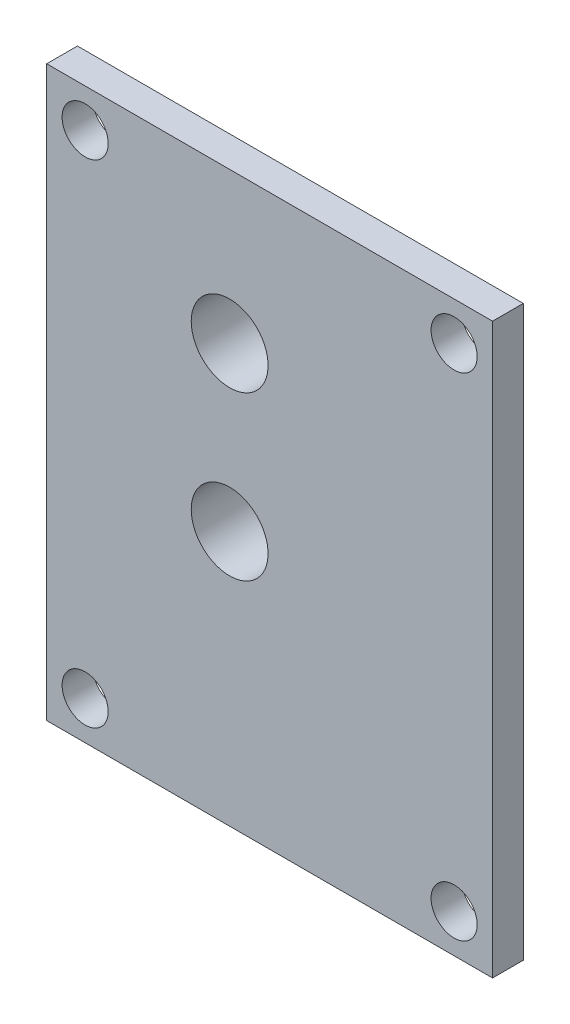
ISO-10303-21;
HEADER;
FILE_DESCRIPTION(('STEP AP214'),'2;1');
FILE_NAME('part.step','',(''),(''),'','','');
FILE_SCHEMA(('AUTOMOTIVE_DESIGN { 1 0 10303 214 1 1 1 1 }'));
ENDSEC;
DATA;
#1=APPLICATION_CONTEXT('core data for automotive mechanical design processes');
#2=APPLICATION_PROTOCOL_DEFINITION('international standard','automotive_design',2000,#1);
#3=PRODUCT_CONTEXT('',#1,'mechanical');
#4=PRODUCT('Part','Part','',(#3));
#5=PRODUCT_RELATED_PRODUCT_CATEGORY('part','',(#4));
#6=PRODUCT_DEFINITION_FORMATION('','',#4);
#7=PRODUCT_DEFINITION_CONTEXT('part definition',#1,'design');
#8=PRODUCT_DEFINITION('design','',#6,#7);
#9=PRODUCT_DEFINITION_SHAPE('','',#8);
#10=(LENGTH_UNIT() NAMED_UNIT(*) SI_UNIT(.MILLI.,.METRE.));
#11=(NAMED_UNIT(*) PLANE_ANGLE_UNIT() SI_UNIT($,.RADIAN.));
#12=(NAMED_UNIT(*) SI_UNIT($,.STERADIAN.) SOLID_ANGLE_UNIT());
#13=UNCERTAINTY_MEASURE_WITH_UNIT(LENGTH_MEASURE(1.E-05),#10,'distance_accuracy_value','');
#14=(GEOMETRIC_REPRESENTATION_CONTEXT(3) GLOBAL_UNCERTAINTY_ASSIGNED_CONTEXT((#13)) GLOBAL_UNIT_ASSIGNED_CONTEXT((#10,
#11,#12)) REPRESENTATION_CONTEXT('',''));
#15=CARTESIAN_POINT('',(0.,0.,0.));
#16=DIRECTION('',(0.,0.,1.));
#17=DIRECTION('',(1.,0.,0.));
#18=AXIS2_PLACEMENT_3D('',#15,#16,#17);
#19=CARTESIAN_POINT('',(0.,0.,3.66263657234832));
#20=DIRECTION('',(0.,0.,-1.));
#21=DIRECTION('',(-1.,0.,0.));
#22=AXIS2_PLACEMENT_3D('',#19,#20,#21);
#23=PLANE('',#22);
#24=CARTESIAN_POINT('',(63.6725369246258,1.84415348007562,3.66263657234832));
#25=DIRECTION('',(0.,0.,-1.));
#26=DIRECTION('',(-1.,0.,0.));
#27=AXIS2_PLACEMENT_3D('',#24,#25,#26);
#28=CIRCLE('',#27,3.5);
#29=CARTESIAN_POINT('',(60.1725369246258,1.84415348007562,3.66263657234832));
#30=VERTEX_POINT('',#29);
#31=EDGE_CURVE('E115',#30,#30,#28,.T.);
#32=ORIENTED_EDGE('',*,*,#31,.F.);
#33=EDGE_LOOP('',(#32));
#34=FACE_BOUND('',#33,.T.);
#35=CARTESIAN_POINT('',(63.6725369246238,12.4441534800763,3.66263657234832));
#36=DIRECTION('',(0.,0.,-1.));
#37=DIRECTION('',(-1.,0.,0.));
#38=AXIS2_PLACEMENT_3D('',#35,#36,#37);
#39=CIRCLE('',#38,3.5);
#40=CARTESIAN_POINT('',(60.1725369246238,12.4441534800763,3.66263657234832));
#41=VERTEX_POINT('',#40);
#42=EDGE_CURVE('E120',#41,#41,#39,.T.);
#43=ORIENTED_EDGE('',*,*,#42,.F.);
#44=EDGE_LOOP('',(#43));
#45=FACE_BOUND('',#44,.T.);
#46=DIRECTION('',(0.,1.,0.));
#47=VECTOR('',#46,1.);
#48=CARTESIAN_POINT('',(80.7725369246258,22.2441534800756,3.66263657234832));
#49=LINE('',#48,#47);
#50=CARTESIAN_POINT('',(80.7725369246258,-14.7558465199244,3.66263657234832));
#51=VERTEX_POINT('',#50);
#52=CARTESIAN_POINT('',(80.7725369246258,22.2441534800756,3.66263657234832));
#53=VERTEX_POINT('',#52);
#54=EDGE_CURVE('E74',#51,#53,#49,.T.);
#55=ORIENTED_EDGE('',*,*,#54,.F.);
#56=DIRECTION('',(1.,0.,0.));
#57=VECTOR('',#56,1.);
#58=CARTESIAN_POINT('',(80.7725369246258,-14.7558465199244,3.66263657234832));
#59=LINE('',#58,#57);
#60=CARTESIAN_POINT('',(51.7725369246258,-14.7558465199244,3.66263657234832));
#61=VERTEX_POINT('',#60);
#62=EDGE_CURVE('E78',#61,#51,#59,.T.);
#63=ORIENTED_EDGE('',*,*,#62,.F.);
#64=DIRECTION('',(0.,-1.,0.));
#65=VECTOR('',#64,1.);
#66=CARTESIAN_POINT('',(51.7725369246258,22.2441534800756,3.66263657234832));
#67=LINE('',#66,#65);
#68=CARTESIAN_POINT('',(51.7725369246258,22.2441534800756,3.66263657234832));
#69=VERTEX_POINT('',#68);
#70=EDGE_CURVE('E58',#69,#61,#67,.T.);
#71=ORIENTED_EDGE('',*,*,#70,.F.);
#72=DIRECTION('',(-1.,0.,0.));
#73=VECTOR('',#72,1.);
#74=CARTESIAN_POINT('',(80.7725369246258,22.2441534800756,3.66263657234832));
#75=LINE('',#74,#73);
#76=EDGE_CURVE('E52',#53,#69,#75,.T.);
#77=ORIENTED_EDGE('',*,*,#76,.F.);
#78=EDGE_LOOP('',(#55,#63,#71,#77));
#79=FACE_BOUND('',#78,.T.);
#80=CARTESIAN_POINT('',(78.2725369246258,19.7441534800756,3.66263657234832));
#81=DIRECTION('',(0.,0.,-1.));
#82=DIRECTION('',(-1.,0.,0.));
#83=AXIS2_PLACEMENT_3D('',#80,#81,#82);
#84=CIRCLE('',#83,1.5);
#85=CARTESIAN_POINT('',(76.7725369246258,19.7441534800756,3.66263657234832));
#86=VERTEX_POINT('',#85);
#87=EDGE_CURVE('E236',#86,#86,#84,.F.);
#88=ORIENTED_EDGE('',*,*,#87,.T.);
#89=EDGE_LOOP('',(#88));
#90=FACE_BOUND('',#89,.T.);
#91=CARTESIAN_POINT('',(54.2725369246258,-12.2558465199244,3.66263657234832));
#92=DIRECTION('',(0.,0.,-1.));
#93=DIRECTION('',(-1.,0.,0.));
#94=AXIS2_PLACEMENT_3D('',#91,#92,#93);
#95=CIRCLE('',#94,1.5);
#96=CARTESIAN_POINT('',(52.7725369246258,-12.2558465199244,3.66263657234832));
#97=VERTEX_POINT('',#96);
#98=EDGE_CURVE('E233',#97,#97,#95,.F.);
#99=ORIENTED_EDGE('',*,*,#98,.T.);
#100=EDGE_LOOP('',(#99));
#101=FACE_BOUND('',#100,.T.);
#102=CARTESIAN_POINT('',(78.2725369246258,-12.2558465199244,3.66263657234832));
#103=DIRECTION('',(0.,0.,-1.));
#104=DIRECTION('',(-1.,0.,0.));
#105=AXIS2_PLACEMENT_3D('',#102,#103,#104);
#106=CIRCLE('',#105,1.5);
#107=CARTESIAN_POINT('',(76.7725369246258,-12.2558465199244,3.66263657234832));
#108=VERTEX_POINT('',#107);
#109=EDGE_CURVE('E230',#108,#108,#106,.F.);
#110=ORIENTED_EDGE('',*,*,#109,.T.);
#111=EDGE_LOOP('',(#110));
#112=FACE_BOUND('',#111,.T.);
#113=CARTESIAN_POINT('',(54.2725369246258,19.7441534800756,3.66263657234832));
#114=DIRECTION('',(0.,0.,-1.));
#115=DIRECTION('',(-1.,0.,0.));
#116=AXIS2_PLACEMENT_3D('',#113,#114,#115);
#117=CIRCLE('',#116,1.5);
#118=CARTESIAN_POINT('',(52.7725369246258,19.7441534800756,3.66263657234832));
#119=VERTEX_POINT('',#118);
#120=EDGE_CURVE('E111',#119,#119,#117,.F.);
#121=ORIENTED_EDGE('',*,*,#120,.T.);
#122=EDGE_LOOP('',(#121));
#123=FACE_BOUND('',#122,.T.);
#124=ADVANCED_FACE('F37',(#34,#45,#79,#90,#101,#112,#123),#23,.T.);
#125=CARTESIAN_POINT('',(0.,0.,5.66263657234832));
#126=DIRECTION('',(0.,0.,-1.));
#127=DIRECTION('',(-1.,0.,0.));
#128=AXIS2_PLACEMENT_3D('',#125,#126,#127);
#129=PLANE('',#128);
#130=CARTESIAN_POINT('',(63.6725369246258,12.4441534800756,5.66263657234832));
#131=DIRECTION('',(0.,0.,-1.));
#132=DIRECTION('',(-1.,0.,0.));
#133=AXIS2_PLACEMENT_3D('',#130,#131,#132);
#134=CIRCLE('',#133,2.5);
#135=CARTESIAN_POINT('',(61.1725369246258,12.4441534800756,5.66263657234832));
#136=VERTEX_POINT('',#135);
#137=EDGE_CURVE('E107',#136,#136,#134,.T.);
#138=ORIENTED_EDGE('',*,*,#137,.T.);
#139=EDGE_LOOP('',(#138));
#140=FACE_BOUND('',#139,.T.);
#141=CARTESIAN_POINT('',(63.6725369246258,1.84415348007562,5.66263657234832));
#142=DIRECTION('',(0.,0.,-1.));
#143=DIRECTION('',(-1.,0.,0.));
#144=AXIS2_PLACEMENT_3D('',#141,#142,#143);
#145=CIRCLE('',#144,2.5);
#146=CARTESIAN_POINT('',(61.1725369246258,1.84415348007562,5.66263657234832));
#147=VERTEX_POINT('',#146);
#148=EDGE_CURVE('E108',#147,#147,#145,.T.);
#149=ORIENTED_EDGE('',*,*,#148,.T.);
#150=EDGE_LOOP('',(#149));
#151=FACE_BOUND('',#150,.T.);
#152=CARTESIAN_POINT('',(54.2725369246258,-12.2558465199244,5.66263657234832));
#153=DIRECTION('',(0.,0.,1.));
#154=DIRECTION('',(1.,0.,0.));
#155=AXIS2_PLACEMENT_3D('',#152,#153,#154);
#156=CIRCLE('',#155,1.5);
#157=CARTESIAN_POINT('',(55.7725369246258,-12.2558465199244,5.66263657234832));
#158=VERTEX_POINT('',#157);
#159=EDGE_CURVE('E214',#158,#158,#156,.T.);
#160=ORIENTED_EDGE('',*,*,#159,.F.);
#161=EDGE_LOOP('',(#160));
#162=FACE_BOUND('',#161,.T.);
#163=CARTESIAN_POINT('',(78.2725369246258,-12.2558465199244,5.66263657234832));
#164=DIRECTION('',(0.,0.,1.));
#165=DIRECTION('',(1.,0.,0.));
#166=AXIS2_PLACEMENT_3D('',#163,#164,#165);
#167=CIRCLE('',#166,1.5);
#168=CARTESIAN_POINT('',(79.7725369246258,-12.2558465199244,5.66263657234832));
#169=VERTEX_POINT('',#168);
#170=EDGE_CURVE('E217',#169,#169,#167,.T.);
#171=ORIENTED_EDGE('',*,*,#170,.F.);
#172=EDGE_LOOP('',(#171));
#173=FACE_BOUND('',#172,.T.);
#174=CARTESIAN_POINT('',(78.2725369246258,19.7441534800756,5.66263657234832));
#175=DIRECTION('',(0.,0.,1.));
#176=DIRECTION('',(1.,0.,0.));
#177=AXIS2_PLACEMENT_3D('',#174,#175,#176);
#178=CIRCLE('',#177,1.5);
#179=CARTESIAN_POINT('',(79.7725369246258,19.7441534800756,5.66263657234832));
#180=VERTEX_POINT('',#179);
#181=EDGE_CURVE('E223',#180,#180,#178,.T.);
#182=ORIENTED_EDGE('',*,*,#181,.F.);
#183=EDGE_LOOP('',(#182));
#184=FACE_BOUND('',#183,.T.);
#185=CARTESIAN_POINT('',(54.2725369246258,19.7441534800756,5.66263657234832));
#186=DIRECTION('',(0.,0.,1.));
#187=DIRECTION('',(1.,0.,0.));
#188=AXIS2_PLACEMENT_3D('',#185,#186,#187);
#189=CIRCLE('',#188,1.5);
#190=CARTESIAN_POINT('',(55.7725369246258,19.7441534800756,5.66263657234832));
#191=VERTEX_POINT('',#190);
#192=EDGE_CURVE('E102',#191,#191,#189,.T.);
#193=ORIENTED_EDGE('',*,*,#192,.F.);
#194=EDGE_LOOP('',(#193));
#195=FACE_BOUND('',#194,.T.);
#196=DIRECTION('',(0.,1.,0.));
#197=VECTOR('',#196,1.);
#198=CARTESIAN_POINT('',(80.7725369246258,22.2441534800756,5.66263657234832));
#199=LINE('',#198,#197);
#200=CARTESIAN_POINT('',(80.7725369246258,-14.7558465199244,5.66263657234832));
#201=VERTEX_POINT('',#200);
#202=CARTESIAN_POINT('',(80.7725369246258,22.2441534800756,5.66263657234832));
#203=VERTEX_POINT('',#202);
#204=EDGE_CURVE('E88',#201,#203,#199,.T.);
#205=ORIENTED_EDGE('',*,*,#204,.T.);
#206=DIRECTION('',(-1.,0.,0.));
#207=VECTOR('',#206,1.);
#208=CARTESIAN_POINT('',(80.7725369246258,22.2441534800756,5.66263657234832));
#209=LINE('',#208,#207);
#210=CARTESIAN_POINT('',(51.7725369246258,22.2441534800756,5.66263657234832));
#211=VERTEX_POINT('',#210);
#212=EDGE_CURVE('E207',#203,#211,#209,.T.);
#213=ORIENTED_EDGE('',*,*,#212,.T.);
#214=DIRECTION('',(0.,-1.,0.));
#215=VECTOR('',#214,1.);
#216=CARTESIAN_POINT('',(51.7725369246258,22.2441534800756,5.66263657234832));
#217=LINE('',#216,#215);
#218=CARTESIAN_POINT('',(51.7725369246258,-14.7558465199244,5.66263657234832));
#219=VERTEX_POINT('',#218);
#220=EDGE_CURVE('E211',#211,#219,#217,.T.);
#221=ORIENTED_EDGE('',*,*,#220,.T.);
#222=DIRECTION('',(1.,0.,0.));
#223=VECTOR('',#222,1.);
#224=CARTESIAN_POINT('',(80.7725369246258,-14.7558465199244,5.66263657234832));
#225=LINE('',#224,#223);
#226=EDGE_CURVE('E213',#219,#201,#225,.T.);
#227=ORIENTED_EDGE('',*,*,#226,.T.);
#228=EDGE_LOOP('',(#205,#213,#221,#227));
#229=FACE_BOUND('',#228,.T.);
#230=ADVANCED_FACE('F146',(#140,#151,#162,#173,#184,#195,#229),#129,.F.);
#231=CARTESIAN_POINT('',(63.6725369246258,12.4441534800756,0.662636572348317));
#232=DIRECTION('',(0.,0.,-1.));
#233=DIRECTION('',(-1.,0.,0.));
#234=AXIS2_PLACEMENT_3D('',#231,#232,#233);
#235=PLANE('',#234);
#236=CARTESIAN_POINT('',(63.6725369246258,12.4441534800756,0.662636572348317));
#237=DIRECTION('',(0.,0.,-1.));
#238=DIRECTION('',(-1.,0.,0.));
#239=AXIS2_PLACEMENT_3D('',#236,#237,#238);
#240=CIRCLE('',#239,3.00000000000208);
#241=CARTESIAN_POINT('',(60.6725369246237,12.4441534800756,0.662636572348317));
#242=VERTEX_POINT('',#241);
#243=EDGE_CURVE('E45',#242,#242,#240,.T.);
#244=ORIENTED_EDGE('',*,*,#243,.T.);
#245=EDGE_LOOP('',(#244));
#246=FACE_BOUND('',#245,.T.);
#247=CARTESIAN_POINT('',(63.6725369246258,12.4441534800756,0.662636572348317));
#248=DIRECTION('',(0.,0.,-1.));
#249=DIRECTION('',(-1.,0.,0.));
#250=AXIS2_PLACEMENT_3D('',#247,#248,#249);
#251=CIRCLE('',#250,2.5);
#252=CARTESIAN_POINT('',(61.1725369246258,12.4441534800756,0.662636572348317));
#253=VERTEX_POINT('',#252);
#254=EDGE_CURVE('E112',#253,#253,#251,.T.);
#255=ORIENTED_EDGE('',*,*,#254,.F.);
#256=EDGE_LOOP('',(#255));
#257=FACE_BOUND('',#256,.T.);
#258=ADVANCED_FACE('F131',(#246,#257),#235,.T.);
#259=CARTESIAN_POINT('',(63.6725369246258,12.4441534800756,0.662636572348317));
#260=DIRECTION('',(0.,0.,1.));
#261=DIRECTION('',(1.,0.,0.));
#262=AXIS2_PLACEMENT_3D('',#259,#260,#261);
#263=CYLINDRICAL_SURFACE('',#262,3.50000000000208);
#264=CARTESIAN_POINT('',(63.6725369246258,12.4441534800756,1.16263657234832));
#265=DIRECTION('',(0.,0.,-1.));
#266=DIRECTION('',(-1.,0.,0.));
#267=AXIS2_PLACEMENT_3D('',#264,#265,#266);
#268=CIRCLE('',#267,3.50000000000208);
#269=CARTESIAN_POINT('',(60.1725369246237,12.4441534800756,1.16263657234832));
#270=VERTEX_POINT('',#269);
#271=EDGE_CURVE('E11',#270,#270,#268,.F.);
#272=ORIENTED_EDGE('',*,*,#271,.T.);
#273=EDGE_LOOP('',(#272));
#274=FACE_BOUND('',#273,.T.);
#275=ORIENTED_EDGE('',*,*,#42,.T.);
#276=EDGE_LOOP('',(#275));
#277=FACE_BOUND('',#276,.T.);
#278=ADVANCED_FACE('F157',(#274,#277),#263,.T.);
#279=CARTESIAN_POINT('',(63.6725369246258,12.4441534800756,0.662636572348317));
#280=DIRECTION('',(0.,0.,1.));
#281=DIRECTION('',(1.,0.,0.));
#282=AXIS2_PLACEMENT_3D('',#279,#280,#281);
#283=CYLINDRICAL_SURFACE('',#282,2.5);
#284=ORIENTED_EDGE('',*,*,#254,.T.);
#285=EDGE_LOOP('',(#284));
#286=FACE_BOUND('',#285,.T.);
#287=ORIENTED_EDGE('',*,*,#137,.F.);
#288=EDGE_LOOP('',(#287));
#289=FACE_BOUND('',#288,.T.);
#290=ADVANCED_FACE('F160',(#286,#289),#283,.F.);
#291=CARTESIAN_POINT('',(63.6725369246258,1.84415348007562,0.662636572348317));
#292=DIRECTION('',(0.,0.,-1.));
#293=DIRECTION('',(-1.,0.,0.));
#294=AXIS2_PLACEMENT_3D('',#291,#292,#293);
#295=PLANE('',#294);
#296=CARTESIAN_POINT('',(63.6725369246258,1.84415348007562,0.662636572348317));
#297=DIRECTION('',(0.,0.,-1.));
#298=DIRECTION('',(-1.,0.,0.));
#299=AXIS2_PLACEMENT_3D('',#296,#297,#298);
#300=CIRCLE('',#299,3.00000000000001);
#301=CARTESIAN_POINT('',(60.6725369246258,1.84415348007562,0.662636572348317));
#302=VERTEX_POINT('',#301);
#303=EDGE_CURVE('E123',#302,#302,#300,.T.);
#304=ORIENTED_EDGE('',*,*,#303,.T.);
#305=EDGE_LOOP('',(#304));
#306=FACE_BOUND('',#305,.T.);
#307=CARTESIAN_POINT('',(63.6725369246258,1.84415348007562,0.662636572348317));
#308=DIRECTION('',(0.,0.,-1.));
#309=DIRECTION('',(-1.,0.,0.));
#310=AXIS2_PLACEMENT_3D('',#307,#308,#309);
#311=CIRCLE('',#310,2.5);
#312=CARTESIAN_POINT('',(61.1725369246258,1.84415348007562,0.662636572348317));
#313=VERTEX_POINT('',#312);
#314=EDGE_CURVE('E104',#313,#313,#311,.T.);
#315=ORIENTED_EDGE('',*,*,#314,.F.);
#316=EDGE_LOOP('',(#315));
#317=FACE_BOUND('',#316,.T.);
#318=ADVANCED_FACE('F166',(#306,#317),#295,.T.);
#319=CARTESIAN_POINT('',(63.6725369246258,1.84415348007562,0.662636572348317));
#320=DIRECTION('',(0.,0.,1.));
#321=DIRECTION('',(1.,0.,0.));
#322=AXIS2_PLACEMENT_3D('',#319,#320,#321);
#323=CYLINDRICAL_SURFACE('',#322,3.50000000000001);
#324=CARTESIAN_POINT('',(63.6725369246258,1.84415348007562,1.16263657234832));
#325=DIRECTION('',(0.,0.,-1.));
#326=DIRECTION('',(-1.,0.,0.));
#327=AXIS2_PLACEMENT_3D('',#324,#325,#326);
#328=CIRCLE('',#327,3.50000000000001);
#329=CARTESIAN_POINT('',(60.1725369246258,1.84415348007562,1.16263657234832));
#330=VERTEX_POINT('',#329);
#331=EDGE_CURVE('E126',#330,#330,#328,.F.);
#332=ORIENTED_EDGE('',*,*,#331,.T.);
#333=EDGE_LOOP('',(#332));
#334=FACE_BOUND('',#333,.T.);
#335=ORIENTED_EDGE('',*,*,#31,.T.);
#336=EDGE_LOOP('',(#335));
#337=FACE_BOUND('',#336,.T.);
#338=ADVANCED_FACE('F168',(#334,#337),#323,.T.);
#339=CARTESIAN_POINT('',(63.6725369246258,1.84415348007562,0.662636572348317));
#340=DIRECTION('',(0.,0.,1.));
#341=DIRECTION('',(1.,0.,0.));
#342=AXIS2_PLACEMENT_3D('',#339,#340,#341);
#343=CYLINDRICAL_SURFACE('',#342,2.5);
#344=ORIENTED_EDGE('',*,*,#314,.T.);
#345=EDGE_LOOP('',(#344));
#346=FACE_BOUND('',#345,.T.);
#347=ORIENTED_EDGE('',*,*,#148,.F.);
#348=EDGE_LOOP('',(#347));
#349=FACE_BOUND('',#348,.T.);
#350=ADVANCED_FACE('F142',(#346,#349),#343,.F.);
#351=CARTESIAN_POINT('',(63.6725369246258,1.84415348007562,1.16263657234832));
#352=DIRECTION('',(0.,0.,-1.));
#353=DIRECTION('',(-1.,0.,0.));
#354=AXIS2_PLACEMENT_3D('',#351,#352,#353);
#355=TOROIDAL_SURFACE('',#354,3.00000000000001,0.5);
#356=ORIENTED_EDGE('',*,*,#331,.F.);
#357=EDGE_LOOP('',(#356));
#358=FACE_BOUND('',#357,.T.);
#359=ORIENTED_EDGE('',*,*,#303,.F.);
#360=EDGE_LOOP('',(#359));
#361=FACE_BOUND('',#360,.T.);
#362=ADVANCED_FACE('F135',(#358,#361),#355,.T.);
#363=CARTESIAN_POINT('',(63.6725369246258,12.4441534800756,1.16263657234832));
#364=DIRECTION('',(0.,0.,-1.));
#365=DIRECTION('',(-1.,0.,0.));
#366=AXIS2_PLACEMENT_3D('',#363,#364,#365);
#367=TOROIDAL_SURFACE('',#366,3.00000000000208,0.5);
#368=ORIENTED_EDGE('',*,*,#271,.F.);
#369=EDGE_LOOP('',(#368));
#370=FACE_BOUND('',#369,.T.);
#371=ORIENTED_EDGE('',*,*,#243,.F.);
#372=EDGE_LOOP('',(#371));
#373=FACE_BOUND('',#372,.T.);
#374=ADVANCED_FACE('F39',(#370,#373),#367,.T.);
#375=CARTESIAN_POINT('',(80.7725369246258,22.2441534800756,-43.3480005218243));
#376=DIRECTION('',(1.,0.,0.));
#377=DIRECTION('',(0.,0.,-1.));
#378=AXIS2_PLACEMENT_3D('',#375,#376,#377);
#379=PLANE('',#378);
#380=DIRECTION('',(0.,0.,1.));
#381=VECTOR('',#380,1.);
#382=CARTESIAN_POINT('',(80.7725369246258,-14.7558465199244,-43.3480005218243));
#383=LINE('',#382,#381);
#384=EDGE_CURVE('E85',#51,#201,#383,.T.);
#385=ORIENTED_EDGE('',*,*,#384,.F.);
#386=ORIENTED_EDGE('',*,*,#54,.T.);
#387=DIRECTION('',(0.,0.,1.));
#388=VECTOR('',#387,1.);
#389=CARTESIAN_POINT('',(80.7725369246258,22.2441534800756,-43.3480005218243));
#390=LINE('',#389,#388);
#391=EDGE_CURVE('E82',#53,#203,#390,.T.);
#392=ORIENTED_EDGE('',*,*,#391,.T.);
#393=ORIENTED_EDGE('',*,*,#204,.F.);
#394=EDGE_LOOP('',(#385,#386,#392,#393));
#395=FACE_BOUND('',#394,.T.);
#396=ADVANCED_FACE('F86',(#395),#379,.T.);
#397=CARTESIAN_POINT('',(80.7725369246258,-14.7558465199244,-43.3480005218243));
#398=DIRECTION('',(0.,-1.,0.));
#399=DIRECTION('',(1.,0.,0.));
#400=AXIS2_PLACEMENT_3D('',#397,#398,#399);
#401=PLANE('',#400);
#402=DIRECTION('',(0.,0.,1.));
#403=VECTOR('',#402,1.);
#404=CARTESIAN_POINT('',(51.7725369246258,-14.7558465199244,-43.3480005218243));
#405=LINE('',#404,#403);
#406=EDGE_CURVE('E94',#61,#219,#405,.T.);
#407=ORIENTED_EDGE('',*,*,#406,.F.);
#408=ORIENTED_EDGE('',*,*,#62,.T.);
#409=ORIENTED_EDGE('',*,*,#384,.T.);
#410=ORIENTED_EDGE('',*,*,#226,.F.);
#411=EDGE_LOOP('',(#407,#408,#409,#410));
#412=FACE_BOUND('',#411,.T.);
#413=ADVANCED_FACE('F93',(#412),#401,.T.);
#414=CARTESIAN_POINT('',(51.7725369246258,22.2441534800756,-43.3480005218243));
#415=DIRECTION('',(-1.,0.,0.));
#416=DIRECTION('',(0.,-1.,0.));
#417=AXIS2_PLACEMENT_3D('',#414,#415,#416);
#418=PLANE('',#417);
#419=DIRECTION('',(0.,0.,1.));
#420=VECTOR('',#419,1.);
#421=CARTESIAN_POINT('',(51.7725369246258,22.2441534800756,-43.3480005218243));
#422=LINE('',#421,#420);
#423=EDGE_CURVE('E101',#69,#211,#422,.T.);
#424=ORIENTED_EDGE('',*,*,#423,.F.);
#425=ORIENTED_EDGE('',*,*,#70,.T.);
#426=ORIENTED_EDGE('',*,*,#406,.T.);
#427=ORIENTED_EDGE('',*,*,#220,.F.);
#428=EDGE_LOOP('',(#424,#425,#426,#427));
#429=FACE_BOUND('',#428,.T.);
#430=ADVANCED_FACE('F197',(#429),#418,.T.);
#431=CARTESIAN_POINT('',(80.7725369246258,22.2441534800756,-43.3480005218243));
#432=DIRECTION('',(0.,1.,0.));
#433=DIRECTION('',(-1.,0.,0.));
#434=AXIS2_PLACEMENT_3D('',#431,#432,#433);
#435=PLANE('',#434);
#436=ORIENTED_EDGE('',*,*,#391,.F.);
#437=ORIENTED_EDGE('',*,*,#76,.T.);
#438=ORIENTED_EDGE('',*,*,#423,.T.);
#439=ORIENTED_EDGE('',*,*,#212,.F.);
#440=EDGE_LOOP('',(#436,#437,#438,#439));
#441=FACE_BOUND('',#440,.T.);
#442=ADVANCED_FACE('F192',(#441),#435,.T.);
#443=CARTESIAN_POINT('',(54.2725369246258,19.7441534800756,-43.3480005218243));
#444=DIRECTION('',(0.,0.,1.));
#445=DIRECTION('',(1.,0.,0.));
#446=AXIS2_PLACEMENT_3D('',#443,#444,#445);
#447=CYLINDRICAL_SURFACE('',#446,1.5);
#448=ORIENTED_EDGE('',*,*,#192,.T.);
#449=EDGE_LOOP('',(#448));
#450=FACE_BOUND('',#449,.T.);
#451=ORIENTED_EDGE('',*,*,#120,.F.);
#452=EDGE_LOOP('',(#451));
#453=FACE_BOUND('',#452,.T.);
#454=ADVANCED_FACE('F189',(#450,#453),#447,.F.);
#455=CARTESIAN_POINT('',(78.2725369246258,19.7441534800756,-43.3480005218243));
#456=DIRECTION('',(0.,0.,1.));
#457=DIRECTION('',(1.,0.,0.));
#458=AXIS2_PLACEMENT_3D('',#455,#456,#457);
#459=CYLINDRICAL_SURFACE('',#458,1.5);
#460=ORIENTED_EDGE('',*,*,#181,.T.);
#461=EDGE_LOOP('',(#460));
#462=FACE_BOUND('',#461,.T.);
#463=ORIENTED_EDGE('',*,*,#87,.F.);
#464=EDGE_LOOP('',(#463));
#465=FACE_BOUND('',#464,.T.);
#466=ADVANCED_FACE('F185',(#462,#465),#459,.F.);
#467=CARTESIAN_POINT('',(78.2725369246258,-12.2558465199244,-43.3480005218243));
#468=DIRECTION('',(0.,0.,1.));
#469=DIRECTION('',(1.,0.,0.));
#470=AXIS2_PLACEMENT_3D('',#467,#468,#469);
#471=CYLINDRICAL_SURFACE('',#470,1.5);
#472=ORIENTED_EDGE('',*,*,#170,.T.);
#473=EDGE_LOOP('',(#472));
#474=FACE_BOUND('',#473,.T.);
#475=ORIENTED_EDGE('',*,*,#109,.F.);
#476=EDGE_LOOP('',(#475));
#477=FACE_BOUND('',#476,.T.);
#478=ADVANCED_FACE('F181',(#474,#477),#471,.F.);
#479=CARTESIAN_POINT('',(54.2725369246258,-12.2558465199244,-43.3480005218243));
#480=DIRECTION('',(0.,0.,1.));
#481=DIRECTION('',(1.,0.,0.));
#482=AXIS2_PLACEMENT_3D('',#479,#480,#481);
#483=CYLINDRICAL_SURFACE('',#482,1.5);
#484=ORIENTED_EDGE('',*,*,#159,.T.);
#485=EDGE_LOOP('',(#484));
#486=FACE_BOUND('',#485,.T.);
#487=ORIENTED_EDGE('',*,*,#98,.F.);
#488=EDGE_LOOP('',(#487));
#489=FACE_BOUND('',#488,.T.);
#490=ADVANCED_FACE('F178',(#486,#489),#483,.F.);
#491=CLOSED_SHELL('',(#124,#230,#258,#278,#290,#318,#338,#350,#362,#374,#396,#413,#430,#442,
#454,#466,#478,#490));
#492=MANIFOLD_SOLID_BREP('B2',#491);
#493=ADVANCED_BREP_SHAPE_REPRESENTATION('',(#18,#492),#14);
#494=SHAPE_DEFINITION_REPRESENTATION(#9,#493);
ENDSEC;
END-ISO-10303-21;
